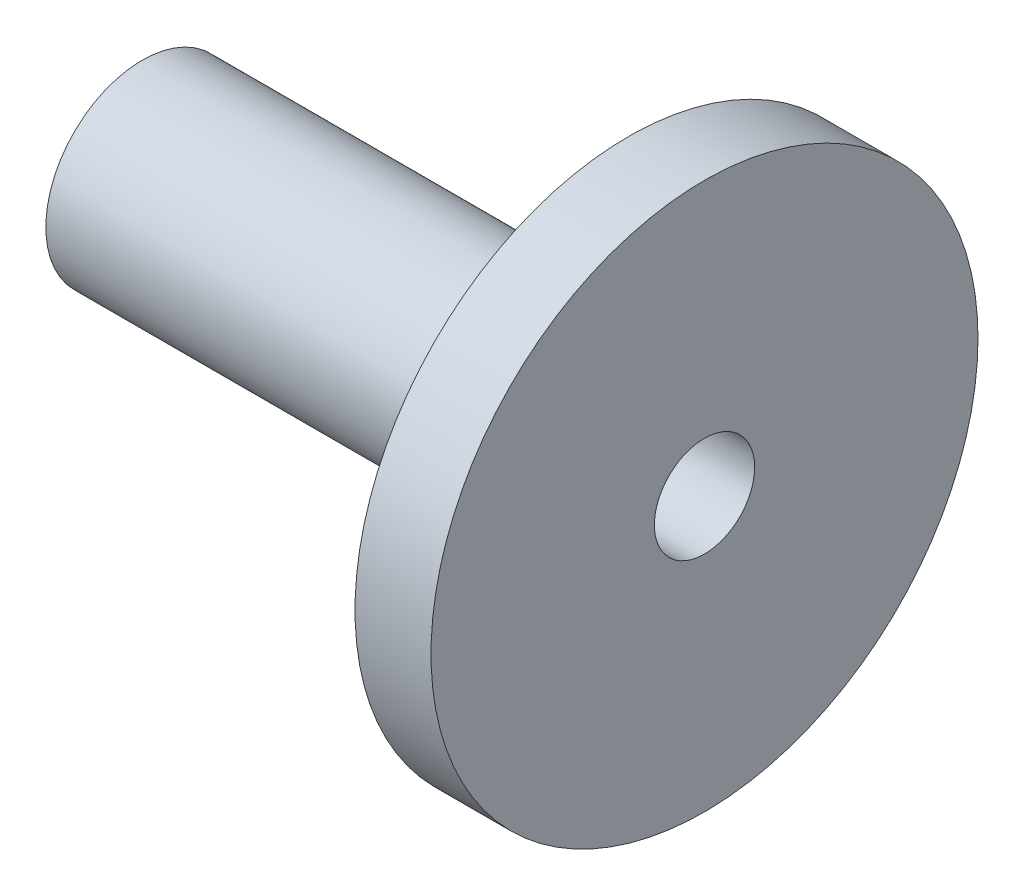
ISO-10303-21;
HEADER;
FILE_DESCRIPTION(('STEP AP214'),'2;1');
FILE_NAME('part.step','',(''),(''),'','','');
FILE_SCHEMA(('AUTOMOTIVE_DESIGN { 1 0 10303 214 1 1 1 1 }'));
ENDSEC;
DATA;
#1=APPLICATION_CONTEXT('core data for automotive mechanical design processes');
#2=APPLICATION_PROTOCOL_DEFINITION('international standard','automotive_design',2000,#1);
#3=PRODUCT_CONTEXT('',#1,'mechanical');
#4=PRODUCT('Part','Part','',(#3));
#5=PRODUCT_RELATED_PRODUCT_CATEGORY('part','',(#4));
#6=PRODUCT_DEFINITION_FORMATION('','',#4);
#7=PRODUCT_DEFINITION_CONTEXT('part definition',#1,'design');
#8=PRODUCT_DEFINITION('design','',#6,#7);
#9=PRODUCT_DEFINITION_SHAPE('','',#8);
#10=(LENGTH_UNIT() NAMED_UNIT(*) SI_UNIT(.MILLI.,.METRE.));
#11=(NAMED_UNIT(*) PLANE_ANGLE_UNIT() SI_UNIT($,.RADIAN.));
#12=(NAMED_UNIT(*) SI_UNIT($,.STERADIAN.) SOLID_ANGLE_UNIT());
#13=UNCERTAINTY_MEASURE_WITH_UNIT(LENGTH_MEASURE(1.E-05),#10,'distance_accuracy_value','');
#14=(GEOMETRIC_REPRESENTATION_CONTEXT(3) GLOBAL_UNCERTAINTY_ASSIGNED_CONTEXT((#13)) GLOBAL_UNIT_ASSIGNED_CONTEXT((#10,
#11,#12)) REPRESENTATION_CONTEXT('',''));
#15=CARTESIAN_POINT('',(0.,0.,0.));
#16=DIRECTION('',(0.,0.,1.));
#17=DIRECTION('',(1.,0.,0.));
#18=AXIS2_PLACEMENT_3D('',#15,#16,#17);
#19=CARTESIAN_POINT('',(-50.,16.8,11.));
#20=DIRECTION('',(1.,0.,0.));
#21=DIRECTION('',(0.,0.,-1.));
#22=AXIS2_PLACEMENT_3D('',#19,#20,#21);
#23=CYLINDRICAL_SURFACE('',#22,9.);
#24=CARTESIAN_POINT('',(-54.,16.8,11.));
#25=DIRECTION('',(1.,0.,0.));
#26=DIRECTION('',(0.,0.,-1.));
#27=AXIS2_PLACEMENT_3D('',#24,#25,#26);
#28=CIRCLE('',#27,9.);
#29=CARTESIAN_POINT('',(-54.,16.8,1.99999999999999));
#30=VERTEX_POINT('',#29);
#31=EDGE_CURVE('E62',#30,#30,#28,.T.);
#32=ORIENTED_EDGE('',*,*,#31,.T.);
#33=EDGE_LOOP('',(#32));
#34=FACE_BOUND('',#33,.T.);
#35=CARTESIAN_POINT('',(-51.5,16.8,11.));
#36=DIRECTION('',(1.,0.,0.));
#37=DIRECTION('',(0.,0.,-1.));
#38=AXIS2_PLACEMENT_3D('',#35,#36,#37);
#39=CIRCLE('',#38,9.);
#40=CARTESIAN_POINT('',(-51.5,16.8,1.99999999999999));
#41=VERTEX_POINT('',#40);
#42=EDGE_CURVE('E10',#41,#41,#39,.T.);
#43=ORIENTED_EDGE('',*,*,#42,.F.);
#44=EDGE_LOOP('',(#43));
#45=FACE_BOUND('',#44,.T.);
#46=ADVANCED_FACE('F37',(#34,#45),#23,.T.);
#47=CARTESIAN_POINT('',(-51.5,16.8,1.99999999999999));
#48=DIRECTION('',(1.,0.,0.));
#49=DIRECTION('',(0.,0.,-1.));
#50=AXIS2_PLACEMENT_3D('',#47,#48,#49);
#51=PLANE('',#50);
#52=ORIENTED_EDGE('',*,*,#42,.T.);
#53=EDGE_LOOP('',(#52));
#54=FACE_BOUND('',#53,.T.);
#55=CARTESIAN_POINT('',(-51.5,16.8,11.));
#56=DIRECTION('',(1.,0.,0.));
#57=DIRECTION('',(0.,0.,-1.));
#58=AXIS2_PLACEMENT_3D('',#55,#56,#57);
#59=CIRCLE('',#58,1.65);
#60=CARTESIAN_POINT('',(-51.5,16.8,9.34999999999999));
#61=VERTEX_POINT('',#60);
#62=EDGE_CURVE('E43',#61,#61,#59,.T.);
#63=ORIENTED_EDGE('',*,*,#62,.F.);
#64=EDGE_LOOP('',(#63));
#65=FACE_BOUND('',#64,.T.);
#66=ADVANCED_FACE('F81',(#54,#65),#51,.T.);
#67=CARTESIAN_POINT('',(-50.,16.8,11.));
#68=DIRECTION('',(1.,0.,0.));
#69=DIRECTION('',(0.,0.,-1.));
#70=AXIS2_PLACEMENT_3D('',#67,#68,#69);
#71=CYLINDRICAL_SURFACE('',#70,1.65);
#72=ORIENTED_EDGE('',*,*,#62,.T.);
#73=EDGE_LOOP('',(#72));
#74=FACE_BOUND('',#73,.T.);
#75=CARTESIAN_POINT('',(-70.,16.8,11.));
#76=DIRECTION('',(1.,0.,0.));
#77=DIRECTION('',(0.,0.,-1.));
#78=AXIS2_PLACEMENT_3D('',#75,#76,#77);
#79=CIRCLE('',#78,1.65);
#80=CARTESIAN_POINT('',(-70.,16.8,9.34999999999999));
#81=VERTEX_POINT('',#80);
#82=EDGE_CURVE('E47',#81,#81,#79,.T.);
#83=ORIENTED_EDGE('',*,*,#82,.F.);
#84=EDGE_LOOP('',(#83));
#85=FACE_BOUND('',#84,.T.);
#86=ADVANCED_FACE('F86',(#74,#85),#71,.F.);
#87=CARTESIAN_POINT('',(-70.,16.8,9.34999999999999));
#88=DIRECTION('',(-1.,0.,0.));
#89=DIRECTION('',(0.,0.,1.));
#90=AXIS2_PLACEMENT_3D('',#87,#88,#89);
#91=PLANE('',#90);
#92=ORIENTED_EDGE('',*,*,#82,.T.);
#93=EDGE_LOOP('',(#92));
#94=FACE_BOUND('',#93,.T.);
#95=CARTESIAN_POINT('',(-70.,16.8,11.));
#96=DIRECTION('',(1.,0.,0.));
#97=DIRECTION('',(0.,0.,-1.));
#98=AXIS2_PLACEMENT_3D('',#95,#96,#97);
#99=CIRCLE('',#98,3.175);
#100=CARTESIAN_POINT('',(-70.,16.8,7.82499999999999));
#101=VERTEX_POINT('',#100);
#102=EDGE_CURVE('E51',#101,#101,#99,.T.);
#103=ORIENTED_EDGE('',*,*,#102,.F.);
#104=EDGE_LOOP('',(#103));
#105=FACE_BOUND('',#104,.T.);
#106=ADVANCED_FACE('F91',(#94,#105),#91,.T.);
#107=CARTESIAN_POINT('',(-50.,16.8,11.));
#108=DIRECTION('',(1.,0.,0.));
#109=DIRECTION('',(0.,0.,-1.));
#110=AXIS2_PLACEMENT_3D('',#107,#108,#109);
#111=CYLINDRICAL_SURFACE('',#110,3.175);
#112=ORIENTED_EDGE('',*,*,#102,.T.);
#113=EDGE_LOOP('',(#112));
#114=FACE_BOUND('',#113,.T.);
#115=CARTESIAN_POINT('',(-55.,16.8,11.));
#116=DIRECTION('',(1.,0.,0.));
#117=DIRECTION('',(0.,0.,-1.));
#118=AXIS2_PLACEMENT_3D('',#115,#116,#117);
#119=CIRCLE('',#118,3.175);
#120=CARTESIAN_POINT('',(-55.,16.8,7.82499999999999));
#121=VERTEX_POINT('',#120);
#122=EDGE_CURVE('E56',#121,#121,#119,.T.);
#123=ORIENTED_EDGE('',*,*,#122,.F.);
#124=EDGE_LOOP('',(#123));
#125=FACE_BOUND('',#124,.T.);
#126=ADVANCED_FACE('F77',(#114,#125),#111,.T.);
#127=CARTESIAN_POINT('',(-54.,16.8,11.));
#128=DIRECTION('',(1.,0.,0.));
#129=DIRECTION('',(0.,0.,-1.));
#130=AXIS2_PLACEMENT_3D('',#127,#128,#129);
#131=CONICAL_SURFACE('',#130,4.17499999999999,0.785398163397453);
#132=ORIENTED_EDGE('',*,*,#122,.T.);
#133=EDGE_LOOP('',(#132));
#134=FACE_BOUND('',#133,.T.);
#135=CARTESIAN_POINT('',(-54.,16.8,11.));
#136=DIRECTION('',(1.,0.,0.));
#137=DIRECTION('',(0.,0.,-1.));
#138=AXIS2_PLACEMENT_3D('',#135,#136,#137);
#139=CIRCLE('',#138,4.17499999999999);
#140=CARTESIAN_POINT('',(-54.,16.8,6.82499999999999));
#141=VERTEX_POINT('',#140);
#142=EDGE_CURVE('E59',#141,#141,#139,.T.);
#143=ORIENTED_EDGE('',*,*,#142,.F.);
#144=EDGE_LOOP('',(#143));
#145=FACE_BOUND('',#144,.T.);
#146=ADVANCED_FACE('F70',(#134,#145),#131,.T.);
#147=CARTESIAN_POINT('',(-54.,16.8,6.82499999999999));
#148=DIRECTION('',(-1.,0.,0.));
#149=DIRECTION('',(0.,0.,1.));
#150=AXIS2_PLACEMENT_3D('',#147,#148,#149);
#151=PLANE('',#150);
#152=ORIENTED_EDGE('',*,*,#142,.T.);
#153=EDGE_LOOP('',(#152));
#154=FACE_BOUND('',#153,.T.);
#155=ORIENTED_EDGE('',*,*,#31,.F.);
#156=EDGE_LOOP('',(#155));
#157=FACE_BOUND('',#156,.T.);
#158=ADVANCED_FACE('F68',(#154,#157),#151,.T.);
#159=CLOSED_SHELL('',(#46,#66,#86,#106,#126,#146,#158));
#160=MANIFOLD_SOLID_BREP('B2',#159);
#161=ADVANCED_BREP_SHAPE_REPRESENTATION('',(#18,#160),#14);
#162=SHAPE_DEFINITION_REPRESENTATION(#9,#161);
ENDSEC;
END-ISO-10303-21;
